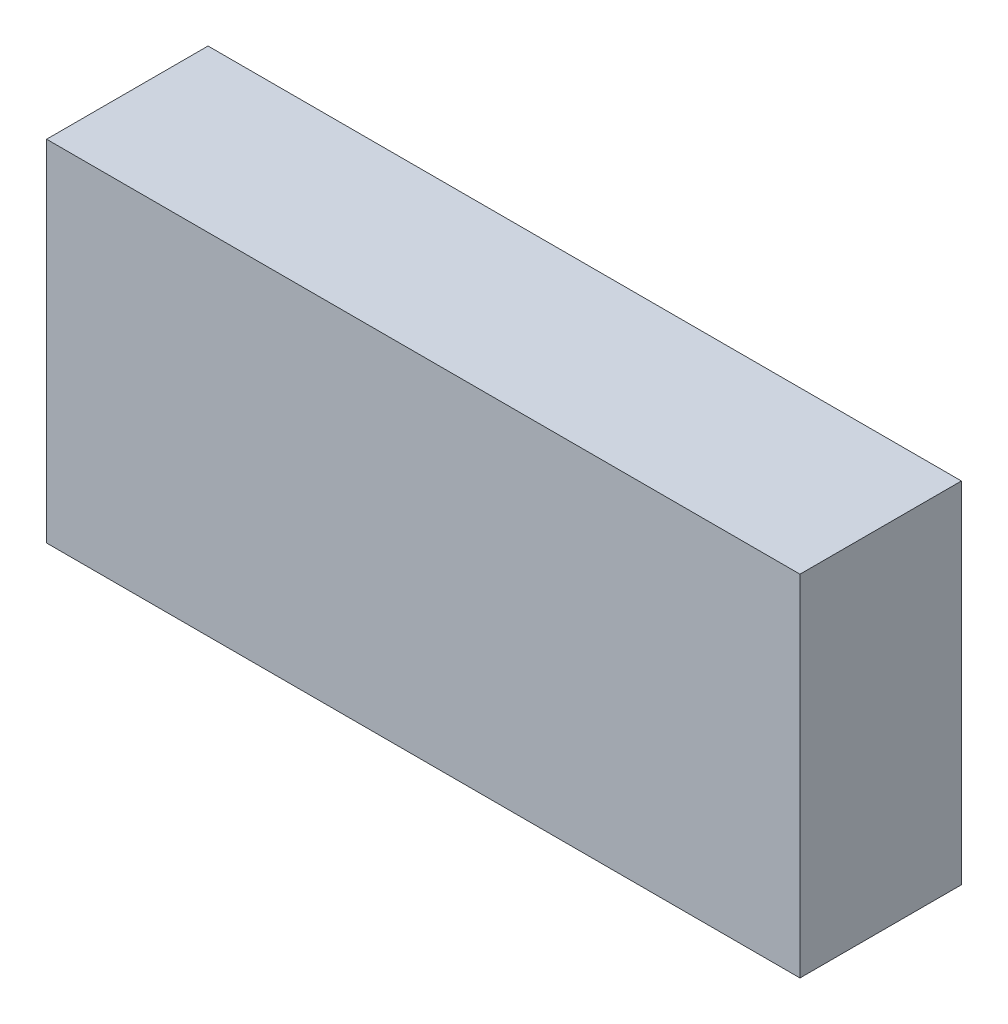
ISO-10303-21;
HEADER;
FILE_DESCRIPTION(('STEP AP214'),'2;1');
FILE_NAME('part.step','',(''),(''),'','','');
FILE_SCHEMA(('AUTOMOTIVE_DESIGN { 1 0 10303 214 1 1 1 1 }'));
ENDSEC;
DATA;
#1=APPLICATION_CONTEXT('core data for automotive mechanical design processes');
#2=APPLICATION_PROTOCOL_DEFINITION('international standard','automotive_design',2000,#1);
#3=PRODUCT_CONTEXT('',#1,'mechanical');
#4=PRODUCT('Part','Part','',(#3));
#5=PRODUCT_RELATED_PRODUCT_CATEGORY('part','',(#4));
#6=PRODUCT_DEFINITION_FORMATION('','',#4);
#7=PRODUCT_DEFINITION_CONTEXT('part definition',#1,'design');
#8=PRODUCT_DEFINITION('design','',#6,#7);
#9=PRODUCT_DEFINITION_SHAPE('','',#8);
#10=(LENGTH_UNIT() NAMED_UNIT(*) SI_UNIT(.MILLI.,.METRE.));
#11=(NAMED_UNIT(*) PLANE_ANGLE_UNIT() SI_UNIT($,.RADIAN.));
#12=(NAMED_UNIT(*) SI_UNIT($,.STERADIAN.) SOLID_ANGLE_UNIT());
#13=UNCERTAINTY_MEASURE_WITH_UNIT(LENGTH_MEASURE(1.E-05),#10,'distance_accuracy_value','');
#14=(GEOMETRIC_REPRESENTATION_CONTEXT(3) GLOBAL_UNCERTAINTY_ASSIGNED_CONTEXT((#13)) GLOBAL_UNIT_ASSIGNED_CONTEXT((#10,
#11,#12)) REPRESENTATION_CONTEXT('',''));
#15=CARTESIAN_POINT('',(0.,0.,0.));
#16=DIRECTION('',(0.,0.,1.));
#17=DIRECTION('',(1.,0.,0.));
#18=AXIS2_PLACEMENT_3D('',#15,#16,#17);
#19=CARTESIAN_POINT('',(0.,0.,0.6));
#20=DIRECTION('',(0.,0.,1.));
#21=DIRECTION('',(1.,0.,0.));
#22=AXIS2_PLACEMENT_3D('',#19,#20,#21);
#23=PLANE('',#22);
#24=DIRECTION('',(1.,0.,0.));
#25=VECTOR('',#24,1.);
#26=CARTESIAN_POINT('',(-1.40001,-0.6499,0.6));
#27=LINE('',#26,#25);
#28=CARTESIAN_POINT('',(-1.40001,-0.6499,0.6));
#29=VERTEX_POINT('',#28);
#30=CARTESIAN_POINT('',(1.40001,-0.6499,0.6));
#31=VERTEX_POINT('',#30);
#32=EDGE_CURVE('E86',#29,#31,#27,.T.);
#33=ORIENTED_EDGE('',*,*,#32,.T.);
#34=DIRECTION('',(0.,1.,0.));
#35=VECTOR('',#34,1.);
#36=CARTESIAN_POINT('',(1.40001,-0.6499,0.6));
#37=LINE('',#36,#35);
#38=CARTESIAN_POINT('',(1.40001,0.6499,0.6));
#39=VERTEX_POINT('',#38);
#40=EDGE_CURVE('E19',#31,#39,#37,.T.);
#41=ORIENTED_EDGE('',*,*,#40,.T.);
#42=DIRECTION('',(-1.,0.,0.));
#43=VECTOR('',#42,1.);
#44=CARTESIAN_POINT('',(1.40001,0.6499,0.6));
#45=LINE('',#44,#43);
#46=CARTESIAN_POINT('',(-1.40001,0.6499,0.6));
#47=VERTEX_POINT('',#46);
#48=EDGE_CURVE('E78',#39,#47,#45,.T.);
#49=ORIENTED_EDGE('',*,*,#48,.T.);
#50=DIRECTION('',(0.,-1.,0.));
#51=VECTOR('',#50,1.);
#52=CARTESIAN_POINT('',(-1.40001,0.6499,0.6));
#53=LINE('',#52,#51);
#54=EDGE_CURVE('E11',#47,#29,#53,.T.);
#55=ORIENTED_EDGE('',*,*,#54,.T.);
#56=EDGE_LOOP('',(#33,#41,#49,#55));
#57=FACE_BOUND('',#56,.T.);
#58=ADVANCED_FACE('F16',(#57),#23,.T.);
#59=CARTESIAN_POINT('',(0.,0.,0.));
#60=DIRECTION('',(0.,0.,1.));
#61=DIRECTION('',(1.,0.,0.));
#62=AXIS2_PLACEMENT_3D('',#59,#60,#61);
#63=PLANE('',#62);
#64=DIRECTION('',(1.,0.,0.));
#65=VECTOR('',#64,1.);
#66=CARTESIAN_POINT('',(-1.40001,-0.6499,0.));
#67=LINE('',#66,#65);
#68=CARTESIAN_POINT('',(-1.40001,-0.6499,0.));
#69=VERTEX_POINT('',#68);
#70=CARTESIAN_POINT('',(1.40001,-0.6499,0.));
#71=VERTEX_POINT('',#70);
#72=EDGE_CURVE('E102',#69,#71,#67,.T.);
#73=ORIENTED_EDGE('',*,*,#72,.F.);
#74=DIRECTION('',(0.,-1.,0.));
#75=VECTOR('',#74,1.);
#76=CARTESIAN_POINT('',(-1.40001,0.6499,0.));
#77=LINE('',#76,#75);
#78=CARTESIAN_POINT('',(-1.40001,0.6499,0.));
#79=VERTEX_POINT('',#78);
#80=EDGE_CURVE('E26',#79,#69,#77,.T.);
#81=ORIENTED_EDGE('',*,*,#80,.F.);
#82=DIRECTION('',(-1.,0.,0.));
#83=VECTOR('',#82,1.);
#84=CARTESIAN_POINT('',(1.40001,0.6499,0.));
#85=LINE('',#84,#83);
#86=CARTESIAN_POINT('',(1.40001,0.6499,0.));
#87=VERTEX_POINT('',#86);
#88=EDGE_CURVE('E72',#87,#79,#85,.T.);
#89=ORIENTED_EDGE('',*,*,#88,.F.);
#90=DIRECTION('',(0.,1.,0.));
#91=VECTOR('',#90,1.);
#92=CARTESIAN_POINT('',(1.40001,-0.6499,0.));
#93=LINE('',#92,#91);
#94=EDGE_CURVE('E54',#71,#87,#93,.T.);
#95=ORIENTED_EDGE('',*,*,#94,.F.);
#96=EDGE_LOOP('',(#73,#81,#89,#95));
#97=FACE_BOUND('',#96,.T.);
#98=ADVANCED_FACE('F108',(#97),#63,.F.);
#99=CARTESIAN_POINT('',(-1.40001,0.6499,0.));
#100=DIRECTION('',(1.,0.,0.));
#101=DIRECTION('',(0.,1.,0.));
#102=AXIS2_PLACEMENT_3D('',#99,#100,#101);
#103=PLANE('',#102);
#104=DIRECTION('',(0.,0.,1.));
#105=VECTOR('',#104,1.);
#106=CARTESIAN_POINT('',(-1.40001,0.6499,0.));
#107=LINE('',#106,#105);
#108=EDGE_CURVE('E83',#79,#47,#107,.T.);
#109=ORIENTED_EDGE('',*,*,#108,.F.);
#110=ORIENTED_EDGE('',*,*,#80,.T.);
#111=DIRECTION('',(0.,0.,1.));
#112=VECTOR('',#111,1.);
#113=CARTESIAN_POINT('',(-1.40001,-0.6499,0.));
#114=LINE('',#113,#112);
#115=EDGE_CURVE('E100',#69,#29,#114,.T.);
#116=ORIENTED_EDGE('',*,*,#115,.T.);
#117=ORIENTED_EDGE('',*,*,#54,.F.);
#118=EDGE_LOOP('',(#109,#110,#116,#117));
#119=FACE_BOUND('',#118,.T.);
#120=ADVANCED_FACE('F105',(#119),#103,.F.);
#121=CARTESIAN_POINT('',(1.40001,0.6499,0.));
#122=DIRECTION('',(0.,-1.,0.));
#123=DIRECTION('',(0.,0.,-1.));
#124=AXIS2_PLACEMENT_3D('',#121,#122,#123);
#125=PLANE('',#124);
#126=DIRECTION('',(0.,0.,1.));
#127=VECTOR('',#126,1.);
#128=CARTESIAN_POINT('',(1.40001,0.6499,0.));
#129=LINE('',#128,#127);
#130=EDGE_CURVE('E82',#87,#39,#129,.T.);
#131=ORIENTED_EDGE('',*,*,#130,.F.);
#132=ORIENTED_EDGE('',*,*,#88,.T.);
#133=ORIENTED_EDGE('',*,*,#108,.T.);
#134=ORIENTED_EDGE('',*,*,#48,.F.);
#135=EDGE_LOOP('',(#131,#132,#133,#134));
#136=FACE_BOUND('',#135,.T.);
#137=ADVANCED_FACE('F80',(#136),#125,.F.);
#138=CARTESIAN_POINT('',(1.40001,-0.6499,0.));
#139=DIRECTION('',(-1.,0.,0.));
#140=DIRECTION('',(0.,0.,1.));
#141=AXIS2_PLACEMENT_3D('',#138,#139,#140);
#142=PLANE('',#141);
#143=DIRECTION('',(0.,0.,1.));
#144=VECTOR('',#143,1.);
#145=CARTESIAN_POINT('',(1.40001,-0.6499,0.));
#146=LINE('',#145,#144);
#147=EDGE_CURVE('E111',#71,#31,#146,.T.);
#148=ORIENTED_EDGE('',*,*,#147,.F.);
#149=ORIENTED_EDGE('',*,*,#94,.T.);
#150=ORIENTED_EDGE('',*,*,#130,.T.);
#151=ORIENTED_EDGE('',*,*,#40,.F.);
#152=EDGE_LOOP('',(#148,#149,#150,#151));
#153=FACE_BOUND('',#152,.T.);
#154=ADVANCED_FACE('F90',(#153),#142,.F.);
#155=CARTESIAN_POINT('',(-1.40001,-0.6499,0.));
#156=DIRECTION('',(0.,1.,0.));
#157=DIRECTION('',(1.,0.,0.));
#158=AXIS2_PLACEMENT_3D('',#155,#156,#157);
#159=PLANE('',#158);
#160=ORIENTED_EDGE('',*,*,#115,.F.);
#161=ORIENTED_EDGE('',*,*,#72,.T.);
#162=ORIENTED_EDGE('',*,*,#147,.T.);
#163=ORIENTED_EDGE('',*,*,#32,.F.);
#164=EDGE_LOOP('',(#160,#161,#162,#163));
#165=FACE_BOUND('',#164,.T.);
#166=ADVANCED_FACE('F113',(#165),#159,.F.);
#167=CLOSED_SHELL('',(#58,#98,#120,#137,#154,#166));
#168=MANIFOLD_SOLID_BREP('B1',#167);
#169=ADVANCED_BREP_SHAPE_REPRESENTATION('',(#18,#168),#14);
#170=SHAPE_DEFINITION_REPRESENTATION(#9,#169);
ENDSEC;
END-ISO-10303-21;
